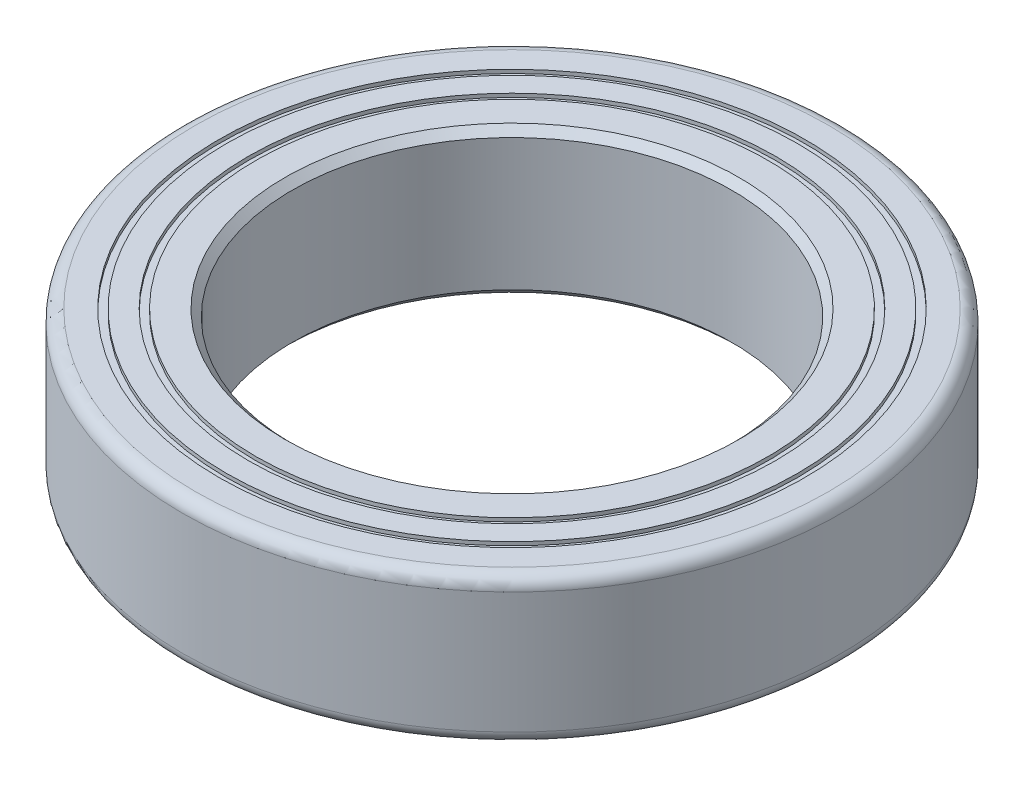
ISO-10303-21;
HEADER;
FILE_DESCRIPTION(('STEP AP214'),'2;1');
FILE_NAME('part.step','',(''),(''),'','','');
FILE_SCHEMA(('AUTOMOTIVE_DESIGN { 1 0 10303 214 1 1 1 1 }'));
ENDSEC;
DATA;
#1=APPLICATION_CONTEXT('core data for automotive mechanical design processes');
#2=APPLICATION_PROTOCOL_DEFINITION('international standard','automotive_design',2000,#1);
#3=PRODUCT_CONTEXT('',#1,'mechanical');
#4=PRODUCT('Part','Part','',(#3));
#5=PRODUCT_RELATED_PRODUCT_CATEGORY('part','',(#4));
#6=PRODUCT_DEFINITION_FORMATION('','',#4);
#7=PRODUCT_DEFINITION_CONTEXT('part definition',#1,'design');
#8=PRODUCT_DEFINITION('design','',#6,#7);
#9=PRODUCT_DEFINITION_SHAPE('','',#8);
#10=(LENGTH_UNIT() NAMED_UNIT(*) SI_UNIT(.MILLI.,.METRE.));
#11=(NAMED_UNIT(*) PLANE_ANGLE_UNIT() SI_UNIT($,.RADIAN.));
#12=(NAMED_UNIT(*) SI_UNIT($,.STERADIAN.) SOLID_ANGLE_UNIT());
#13=UNCERTAINTY_MEASURE_WITH_UNIT(LENGTH_MEASURE(1.E-05),#10,'distance_accuracy_value','');
#14=(GEOMETRIC_REPRESENTATION_CONTEXT(3) GLOBAL_UNCERTAINTY_ASSIGNED_CONTEXT((#13)) GLOBAL_UNIT_ASSIGNED_CONTEXT((#10,
#11,#12)) REPRESENTATION_CONTEXT('',''));
#15=CARTESIAN_POINT('',(0.,0.,0.));
#16=DIRECTION('',(0.,0.,1.));
#17=DIRECTION('',(1.,0.,0.));
#18=AXIS2_PLACEMENT_3D('',#15,#16,#17);
#19=CARTESIAN_POINT('',(9.,0.,0.));
#20=DIRECTION('',(0.,1.,0.));
#21=DIRECTION('',(0.,0.,1.));
#22=AXIS2_PLACEMENT_3D('',#19,#20,#21);
#23=PLANE('',#22);
#24=CARTESIAN_POINT('',(0.,0.,0.));
#25=DIRECTION('',(0.,1.,0.));
#26=DIRECTION('',(0.,0.,1.));
#27=AXIS2_PLACEMENT_3D('',#24,#25,#26);
#28=CIRCLE('',#27,8.656);
#29=CARTESIAN_POINT('',(0.,0.,8.656));
#30=VERTEX_POINT('',#29);
#31=EDGE_CURVE('E69',#30,#30,#28,.F.);
#32=ORIENTED_EDGE('',*,*,#31,.T.);
#33=EDGE_LOOP('',(#32));
#34=FACE_BOUND('',#33,.T.);
#35=CARTESIAN_POINT('',(0.,0.,0.));
#36=DIRECTION('',(0.,1.,0.));
#37=DIRECTION('',(0.,0.,1.));
#38=AXIS2_PLACEMENT_3D('',#35,#36,#37);
#39=CIRCLE('',#38,8.);
#40=CARTESIAN_POINT('',(0.,0.,8.));
#41=VERTEX_POINT('',#40);
#42=EDGE_CURVE('E78',#41,#41,#39,.T.);
#43=ORIENTED_EDGE('',*,*,#42,.T.);
#44=EDGE_LOOP('',(#43));
#45=FACE_BOUND('',#44,.T.);
#46=ADVANCED_FACE('F45',(#34,#45),#23,.F.);
#47=CARTESIAN_POINT('',(0.,2.,0.));
#48=DIRECTION('',(0.,1.,0.));
#49=DIRECTION('',(0.,0.,1.));
#50=AXIS2_PLACEMENT_3D('',#47,#48,#49);
#51=CYLINDRICAL_SURFACE('',#50,8.);
#52=ORIENTED_EDGE('',*,*,#42,.F.);
#53=EDGE_LOOP('',(#52));
#54=FACE_BOUND('',#53,.T.);
#55=CARTESIAN_POINT('',(0.,0.1,0.));
#56=DIRECTION('',(0.,1.,0.));
#57=DIRECTION('',(0.,0.,1.));
#58=AXIS2_PLACEMENT_3D('',#55,#56,#57);
#59=CIRCLE('',#58,8.);
#60=CARTESIAN_POINT('',(0.,0.1,8.));
#61=VERTEX_POINT('',#60);
#62=EDGE_CURVE('E81',#61,#61,#59,.T.);
#63=ORIENTED_EDGE('',*,*,#62,.T.);
#64=EDGE_LOOP('',(#63));
#65=FACE_BOUND('',#64,.T.);
#66=ADVANCED_FACE('F145',(#54,#65),#51,.F.);
#67=CARTESIAN_POINT('',(8.,0.1,0.));
#68=DIRECTION('',(0.,1.,0.));
#69=DIRECTION('',(0.,0.,1.));
#70=AXIS2_PLACEMENT_3D('',#67,#68,#69);
#71=PLANE('',#70);
#72=ORIENTED_EDGE('',*,*,#62,.F.);
#73=EDGE_LOOP('',(#72));
#74=FACE_BOUND('',#73,.T.);
#75=CARTESIAN_POINT('',(0.,0.1,0.));
#76=DIRECTION('',(0.,1.,0.));
#77=DIRECTION('',(0.,0.,1.));
#78=AXIS2_PLACEMENT_3D('',#75,#76,#77);
#79=CIRCLE('',#78,7.8);
#80=CARTESIAN_POINT('',(0.,0.1,7.8));
#81=VERTEX_POINT('',#80);
#82=EDGE_CURVE('E84',#81,#81,#79,.T.);
#83=ORIENTED_EDGE('',*,*,#82,.T.);
#84=EDGE_LOOP('',(#83));
#85=FACE_BOUND('',#84,.T.);
#86=ADVANCED_FACE('F151',(#74,#85),#71,.F.);
#87=CARTESIAN_POINT('',(0.,2.,0.));
#88=DIRECTION('',(0.,1.,0.));
#89=DIRECTION('',(0.,0.,1.));
#90=AXIS2_PLACEMENT_3D('',#87,#88,#89);
#91=CYLINDRICAL_SURFACE('',#90,7.8);
#92=ORIENTED_EDGE('',*,*,#82,.F.);
#93=EDGE_LOOP('',(#92));
#94=FACE_BOUND('',#93,.T.);
#95=CARTESIAN_POINT('',(0.,0.,0.));
#96=DIRECTION('',(0.,1.,0.));
#97=DIRECTION('',(0.,0.,1.));
#98=AXIS2_PLACEMENT_3D('',#95,#96,#97);
#99=CIRCLE('',#98,7.8);
#100=CARTESIAN_POINT('',(0.,0.,7.8));
#101=VERTEX_POINT('',#100);
#102=EDGE_CURVE('E87',#101,#101,#99,.T.);
#103=ORIENTED_EDGE('',*,*,#102,.T.);
#104=EDGE_LOOP('',(#103));
#105=FACE_BOUND('',#104,.T.);
#106=ADVANCED_FACE('F205',(#94,#105),#91,.T.);
#107=CARTESIAN_POINT('',(7.2,0.,0.));
#108=DIRECTION('',(0.,1.,0.));
#109=DIRECTION('',(0.,0.,1.));
#110=AXIS2_PLACEMENT_3D('',#107,#108,#109);
#111=PLANE('',#110);
#112=ORIENTED_EDGE('',*,*,#102,.F.);
#113=EDGE_LOOP('',(#112));
#114=FACE_BOUND('',#113,.T.);
#115=CARTESIAN_POINT('',(0.,0.,0.));
#116=DIRECTION('',(0.,1.,0.));
#117=DIRECTION('',(0.,0.,1.));
#118=AXIS2_PLACEMENT_3D('',#115,#116,#117);
#119=CIRCLE('',#118,7.2);
#120=CARTESIAN_POINT('',(0.,0.,7.2));
#121=VERTEX_POINT('',#120);
#122=EDGE_CURVE('E90',#121,#121,#119,.T.);
#123=ORIENTED_EDGE('',*,*,#122,.T.);
#124=EDGE_LOOP('',(#123));
#125=FACE_BOUND('',#124,.T.);
#126=ADVANCED_FACE('F201',(#114,#125),#111,.F.);
#127=CARTESIAN_POINT('',(0.,2.,0.));
#128=DIRECTION('',(0.,1.,0.));
#129=DIRECTION('',(0.,0.,1.));
#130=AXIS2_PLACEMENT_3D('',#127,#128,#129);
#131=CYLINDRICAL_SURFACE('',#130,7.2);
#132=ORIENTED_EDGE('',*,*,#122,.F.);
#133=EDGE_LOOP('',(#132));
#134=FACE_BOUND('',#133,.T.);
#135=CARTESIAN_POINT('',(0.,0.1,0.));
#136=DIRECTION('',(0.,1.,0.));
#137=DIRECTION('',(0.,0.,1.));
#138=AXIS2_PLACEMENT_3D('',#135,#136,#137);
#139=CIRCLE('',#138,7.2);
#140=CARTESIAN_POINT('',(0.,0.1,7.2));
#141=VERTEX_POINT('',#140);
#142=EDGE_CURVE('E93',#141,#141,#139,.T.);
#143=ORIENTED_EDGE('',*,*,#142,.T.);
#144=EDGE_LOOP('',(#143));
#145=FACE_BOUND('',#144,.T.);
#146=ADVANCED_FACE('F193',(#134,#145),#131,.F.);
#147=CARTESIAN_POINT('',(7.,0.1,0.));
#148=DIRECTION('',(0.,1.,0.));
#149=DIRECTION('',(0.,0.,1.));
#150=AXIS2_PLACEMENT_3D('',#147,#148,#149);
#151=PLANE('',#150);
#152=ORIENTED_EDGE('',*,*,#142,.F.);
#153=EDGE_LOOP('',(#152));
#154=FACE_BOUND('',#153,.T.);
#155=CARTESIAN_POINT('',(0.,0.1,0.));
#156=DIRECTION('',(0.,1.,0.));
#157=DIRECTION('',(0.,0.,1.));
#158=AXIS2_PLACEMENT_3D('',#155,#156,#157);
#159=CIRCLE('',#158,7.);
#160=CARTESIAN_POINT('',(0.,0.1,7.));
#161=VERTEX_POINT('',#160);
#162=EDGE_CURVE('E96',#161,#161,#159,.T.);
#163=ORIENTED_EDGE('',*,*,#162,.T.);
#164=EDGE_LOOP('',(#163));
#165=FACE_BOUND('',#164,.T.);
#166=ADVANCED_FACE('F186',(#154,#165),#151,.F.);
#167=CARTESIAN_POINT('',(0.,2.,0.));
#168=DIRECTION('',(0.,1.,0.));
#169=DIRECTION('',(0.,0.,1.));
#170=AXIS2_PLACEMENT_3D('',#167,#168,#169);
#171=CYLINDRICAL_SURFACE('',#170,7.);
#172=ORIENTED_EDGE('',*,*,#162,.F.);
#173=EDGE_LOOP('',(#172));
#174=FACE_BOUND('',#173,.T.);
#175=CARTESIAN_POINT('',(0.,0.,0.));
#176=DIRECTION('',(0.,1.,0.));
#177=DIRECTION('',(0.,0.,1.));
#178=AXIS2_PLACEMENT_3D('',#175,#176,#177);
#179=CIRCLE('',#178,7.);
#180=CARTESIAN_POINT('',(0.,0.,7.));
#181=VERTEX_POINT('',#180);
#182=EDGE_CURVE('E99',#181,#181,#179,.T.);
#183=ORIENTED_EDGE('',*,*,#182,.T.);
#184=EDGE_LOOP('',(#183));
#185=FACE_BOUND('',#184,.T.);
#186=ADVANCED_FACE('F181',(#174,#185),#171,.T.);
#187=CARTESIAN_POINT('',(6.,0.,0.));
#188=DIRECTION('',(0.,1.,0.));
#189=DIRECTION('',(0.,0.,1.));
#190=AXIS2_PLACEMENT_3D('',#187,#188,#189);
#191=PLANE('',#190);
#192=CARTESIAN_POINT('',(0.,0.,0.));
#193=DIRECTION('',(0.,1.,0.));
#194=DIRECTION('',(0.,0.,1.));
#195=AXIS2_PLACEMENT_3D('',#192,#193,#194);
#196=CIRCLE('',#195,6.2);
#197=CARTESIAN_POINT('',(0.,0.,6.2));
#198=VERTEX_POINT('',#197);
#199=EDGE_CURVE('E61',#198,#198,#196,.T.);
#200=ORIENTED_EDGE('',*,*,#199,.T.);
#201=EDGE_LOOP('',(#200));
#202=FACE_BOUND('',#201,.T.);
#203=ORIENTED_EDGE('',*,*,#182,.F.);
#204=EDGE_LOOP('',(#203));
#205=FACE_BOUND('',#204,.T.);
#206=ADVANCED_FACE('F177',(#202,#205),#191,.F.);
#207=CARTESIAN_POINT('',(0.,2.,0.));
#208=DIRECTION('',(0.,1.,0.));
#209=DIRECTION('',(0.,0.,1.));
#210=AXIS2_PLACEMENT_3D('',#207,#208,#209);
#211=CYLINDRICAL_SURFACE('',#210,6.);
#212=CARTESIAN_POINT('',(0.,0.200000000000003,0.));
#213=DIRECTION('',(0.,1.,0.));
#214=DIRECTION('',(0.,0.,1.));
#215=AXIS2_PLACEMENT_3D('',#212,#213,#214);
#216=CIRCLE('',#215,6.);
#217=CARTESIAN_POINT('',(0.,0.200000000000003,6.));
#218=VERTEX_POINT('',#217);
#219=EDGE_CURVE('E53',#218,#218,#216,.F.);
#220=ORIENTED_EDGE('',*,*,#219,.T.);
#221=EDGE_LOOP('',(#220));
#222=FACE_BOUND('',#221,.T.);
#223=CARTESIAN_POINT('',(0.,3.80000000000001,0.));
#224=DIRECTION('',(0.,-1.,0.));
#225=DIRECTION('',(0.,0.,-1.));
#226=AXIS2_PLACEMENT_3D('',#223,#224,#225);
#227=CIRCLE('',#226,6.);
#228=CARTESIAN_POINT('',(0.,3.80000000000001,6.));
#229=VERTEX_POINT('',#228);
#230=EDGE_CURVE('E57',#229,#229,#227,.F.);
#231=ORIENTED_EDGE('',*,*,#230,.T.);
#232=EDGE_LOOP('',(#231));
#233=FACE_BOUND('',#232,.T.);
#234=ADVANCED_FACE('F180',(#222,#233),#211,.F.);
#235=CARTESIAN_POINT('',(6.,4.,0.));
#236=DIRECTION('',(0.,-1.,0.));
#237=DIRECTION('',(0.,0.,-1.));
#238=AXIS2_PLACEMENT_3D('',#235,#236,#237);
#239=PLANE('',#238);
#240=CARTESIAN_POINT('',(0.,4.,0.));
#241=DIRECTION('',(0.,-1.,0.));
#242=DIRECTION('',(0.,0.,-1.));
#243=AXIS2_PLACEMENT_3D('',#240,#241,#242);
#244=CIRCLE('',#243,6.19999999999999);
#245=CARTESIAN_POINT('',(0.,4.,6.19999999999999));
#246=VERTEX_POINT('',#245);
#247=EDGE_CURVE('E10',#246,#246,#244,.T.);
#248=ORIENTED_EDGE('',*,*,#247,.T.);
#249=EDGE_LOOP('',(#248));
#250=FACE_BOUND('',#249,.T.);
#251=CARTESIAN_POINT('',(0.,4.,0.));
#252=DIRECTION('',(0.,1.,0.));
#253=DIRECTION('',(0.,0.,1.));
#254=AXIS2_PLACEMENT_3D('',#251,#252,#253);
#255=CIRCLE('',#254,7.);
#256=CARTESIAN_POINT('',(0.,4.,7.));
#257=VERTEX_POINT('',#256);
#258=EDGE_CURVE('E102',#257,#257,#255,.T.);
#259=ORIENTED_EDGE('',*,*,#258,.T.);
#260=EDGE_LOOP('',(#259));
#261=FACE_BOUND('',#260,.T.);
#262=ADVANCED_FACE('F272',(#250,#261),#239,.F.);
#263=CARTESIAN_POINT('',(0.,2.,0.));
#264=DIRECTION('',(0.,1.,0.));
#265=DIRECTION('',(0.,0.,1.));
#266=AXIS2_PLACEMENT_3D('',#263,#264,#265);
#267=CYLINDRICAL_SURFACE('',#266,7.);
#268=ORIENTED_EDGE('',*,*,#258,.F.);
#269=EDGE_LOOP('',(#268));
#270=FACE_BOUND('',#269,.T.);
#271=CARTESIAN_POINT('',(0.,3.9,0.));
#272=DIRECTION('',(0.,1.,0.));
#273=DIRECTION('',(0.,0.,1.));
#274=AXIS2_PLACEMENT_3D('',#271,#272,#273);
#275=CIRCLE('',#274,7.);
#276=CARTESIAN_POINT('',(0.,3.9,7.));
#277=VERTEX_POINT('',#276);
#278=EDGE_CURVE('E105',#277,#277,#275,.T.);
#279=ORIENTED_EDGE('',*,*,#278,.T.);
#280=EDGE_LOOP('',(#279));
#281=FACE_BOUND('',#280,.T.);
#282=ADVANCED_FACE('F279',(#270,#281),#267,.T.);
#283=CARTESIAN_POINT('',(7.,3.9,0.));
#284=DIRECTION('',(0.,-1.,0.));
#285=DIRECTION('',(0.,0.,-1.));
#286=AXIS2_PLACEMENT_3D('',#283,#284,#285);
#287=PLANE('',#286);
#288=ORIENTED_EDGE('',*,*,#278,.F.);
#289=EDGE_LOOP('',(#288));
#290=FACE_BOUND('',#289,.T.);
#291=CARTESIAN_POINT('',(0.,3.9,0.));
#292=DIRECTION('',(0.,1.,0.));
#293=DIRECTION('',(0.,0.,1.));
#294=AXIS2_PLACEMENT_3D('',#291,#292,#293);
#295=CIRCLE('',#294,7.2);
#296=CARTESIAN_POINT('',(0.,3.9,7.2));
#297=VERTEX_POINT('',#296);
#298=EDGE_CURVE('E108',#297,#297,#295,.T.);
#299=ORIENTED_EDGE('',*,*,#298,.T.);
#300=EDGE_LOOP('',(#299));
#301=FACE_BOUND('',#300,.T.);
#302=ADVANCED_FACE('F287',(#290,#301),#287,.F.);
#303=CARTESIAN_POINT('',(0.,2.,0.));
#304=DIRECTION('',(0.,1.,0.));
#305=DIRECTION('',(0.,0.,1.));
#306=AXIS2_PLACEMENT_3D('',#303,#304,#305);
#307=CYLINDRICAL_SURFACE('',#306,7.2);
#308=ORIENTED_EDGE('',*,*,#298,.F.);
#309=EDGE_LOOP('',(#308));
#310=FACE_BOUND('',#309,.T.);
#311=CARTESIAN_POINT('',(0.,4.,0.));
#312=DIRECTION('',(0.,1.,0.));
#313=DIRECTION('',(0.,0.,1.));
#314=AXIS2_PLACEMENT_3D('',#311,#312,#313);
#315=CIRCLE('',#314,7.2);
#316=CARTESIAN_POINT('',(0.,4.,7.2));
#317=VERTEX_POINT('',#316);
#318=EDGE_CURVE('E111',#317,#317,#315,.T.);
#319=ORIENTED_EDGE('',*,*,#318,.T.);
#320=EDGE_LOOP('',(#319));
#321=FACE_BOUND('',#320,.T.);
#322=ADVANCED_FACE('F297',(#310,#321),#307,.F.);
#323=CARTESIAN_POINT('',(7.2,4.,0.));
#324=DIRECTION('',(0.,-1.,0.));
#325=DIRECTION('',(0.,0.,-1.));
#326=AXIS2_PLACEMENT_3D('',#323,#324,#325);
#327=PLANE('',#326);
#328=ORIENTED_EDGE('',*,*,#318,.F.);
#329=EDGE_LOOP('',(#328));
#330=FACE_BOUND('',#329,.T.);
#331=CARTESIAN_POINT('',(0.,4.,0.));
#332=DIRECTION('',(0.,1.,0.));
#333=DIRECTION('',(0.,0.,1.));
#334=AXIS2_PLACEMENT_3D('',#331,#332,#333);
#335=CIRCLE('',#334,7.8);
#336=CARTESIAN_POINT('',(0.,4.,7.8));
#337=VERTEX_POINT('',#336);
#338=EDGE_CURVE('E114',#337,#337,#335,.T.);
#339=ORIENTED_EDGE('',*,*,#338,.T.);
#340=EDGE_LOOP('',(#339));
#341=FACE_BOUND('',#340,.T.);
#342=ADVANCED_FACE('F307',(#330,#341),#327,.F.);
#343=CARTESIAN_POINT('',(0.,2.,0.));
#344=DIRECTION('',(0.,1.,0.));
#345=DIRECTION('',(0.,0.,1.));
#346=AXIS2_PLACEMENT_3D('',#343,#344,#345);
#347=CYLINDRICAL_SURFACE('',#346,7.8);
#348=ORIENTED_EDGE('',*,*,#338,.F.);
#349=EDGE_LOOP('',(#348));
#350=FACE_BOUND('',#349,.T.);
#351=CARTESIAN_POINT('',(0.,3.9,0.));
#352=DIRECTION('',(0.,1.,0.));
#353=DIRECTION('',(0.,0.,1.));
#354=AXIS2_PLACEMENT_3D('',#351,#352,#353);
#355=CIRCLE('',#354,7.8);
#356=CARTESIAN_POINT('',(0.,3.9,7.8));
#357=VERTEX_POINT('',#356);
#358=EDGE_CURVE('E117',#357,#357,#355,.T.);
#359=ORIENTED_EDGE('',*,*,#358,.T.);
#360=EDGE_LOOP('',(#359));
#361=FACE_BOUND('',#360,.T.);
#362=ADVANCED_FACE('F318',(#350,#361),#347,.T.);
#363=CARTESIAN_POINT('',(8.,3.9,0.));
#364=DIRECTION('',(0.,-1.,0.));
#365=DIRECTION('',(0.,0.,-1.));
#366=AXIS2_PLACEMENT_3D('',#363,#364,#365);
#367=PLANE('',#366);
#368=ORIENTED_EDGE('',*,*,#358,.F.);
#369=EDGE_LOOP('',(#368));
#370=FACE_BOUND('',#369,.T.);
#371=CARTESIAN_POINT('',(0.,3.9,0.));
#372=DIRECTION('',(0.,1.,0.));
#373=DIRECTION('',(0.,0.,1.));
#374=AXIS2_PLACEMENT_3D('',#371,#372,#373);
#375=CIRCLE('',#374,8.);
#376=CARTESIAN_POINT('',(0.,3.9,8.));
#377=VERTEX_POINT('',#376);
#378=EDGE_CURVE('E120',#377,#377,#375,.T.);
#379=ORIENTED_EDGE('',*,*,#378,.T.);
#380=EDGE_LOOP('',(#379));
#381=FACE_BOUND('',#380,.T.);
#382=ADVANCED_FACE('F142',(#370,#381),#367,.F.);
#383=CARTESIAN_POINT('',(0.,2.,0.));
#384=DIRECTION('',(0.,1.,0.));
#385=DIRECTION('',(0.,0.,1.));
#386=AXIS2_PLACEMENT_3D('',#383,#384,#385);
#387=CYLINDRICAL_SURFACE('',#386,8.);
#388=ORIENTED_EDGE('',*,*,#378,.F.);
#389=EDGE_LOOP('',(#388));
#390=FACE_BOUND('',#389,.T.);
#391=CARTESIAN_POINT('',(0.,4.,0.));
#392=DIRECTION('',(0.,1.,0.));
#393=DIRECTION('',(0.,0.,1.));
#394=AXIS2_PLACEMENT_3D('',#391,#392,#393);
#395=CIRCLE('',#394,8.);
#396=CARTESIAN_POINT('',(0.,4.,8.));
#397=VERTEX_POINT('',#396);
#398=EDGE_CURVE('E123',#397,#397,#395,.T.);
#399=ORIENTED_EDGE('',*,*,#398,.T.);
#400=EDGE_LOOP('',(#399));
#401=FACE_BOUND('',#400,.T.);
#402=ADVANCED_FACE('F127',(#390,#401),#387,.F.);
#403=CARTESIAN_POINT('',(9.,4.,0.));
#404=DIRECTION('',(0.,-1.,0.));
#405=DIRECTION('',(0.,0.,-1.));
#406=AXIS2_PLACEMENT_3D('',#403,#404,#405);
#407=PLANE('',#406);
#408=CARTESIAN_POINT('',(0.,4.,0.));
#409=DIRECTION('',(0.,-1.,0.));
#410=DIRECTION('',(0.,0.,-1.));
#411=AXIS2_PLACEMENT_3D('',#408,#409,#410);
#412=CIRCLE('',#411,8.656);
#413=CARTESIAN_POINT('',(0.,4.,-8.656));
#414=VERTEX_POINT('',#413);
#415=EDGE_CURVE('E66',#414,#414,#412,.F.);
#416=ORIENTED_EDGE('',*,*,#415,.T.);
#417=EDGE_LOOP('',(#416));
#418=FACE_BOUND('',#417,.T.);
#419=ORIENTED_EDGE('',*,*,#398,.F.);
#420=EDGE_LOOP('',(#419));
#421=FACE_BOUND('',#420,.T.);
#422=ADVANCED_FACE('F129',(#418,#421),#407,.F.);
#423=CARTESIAN_POINT('',(0.,2.,0.));
#424=DIRECTION('',(0.,1.,0.));
#425=DIRECTION('',(0.,0.,1.));
#426=AXIS2_PLACEMENT_3D('',#423,#424,#425);
#427=CYLINDRICAL_SURFACE('',#426,9.);
#428=CARTESIAN_POINT('',(0.,0.344,0.));
#429=DIRECTION('',(0.,1.,0.));
#430=DIRECTION('',(0.,0.,1.));
#431=AXIS2_PLACEMENT_3D('',#428,#429,#430);
#432=CIRCLE('',#431,9.);
#433=CARTESIAN_POINT('',(0.,0.344,9.));
#434=VERTEX_POINT('',#433);
#435=EDGE_CURVE('E72',#434,#434,#432,.T.);
#436=ORIENTED_EDGE('',*,*,#435,.T.);
#437=EDGE_LOOP('',(#436));
#438=FACE_BOUND('',#437,.T.);
#439=CARTESIAN_POINT('',(0.,3.656,0.));
#440=DIRECTION('',(0.,-1.,0.));
#441=DIRECTION('',(0.,0.,-1.));
#442=AXIS2_PLACEMENT_3D('',#439,#440,#441);
#443=CIRCLE('',#442,9.);
#444=CARTESIAN_POINT('',(0.,3.656,-9.));
#445=VERTEX_POINT('',#444);
#446=EDGE_CURVE('E75',#445,#445,#443,.T.);
#447=ORIENTED_EDGE('',*,*,#446,.T.);
#448=EDGE_LOOP('',(#447));
#449=FACE_BOUND('',#448,.T.);
#450=ADVANCED_FACE('F131',(#438,#449),#427,.T.);
#451=CARTESIAN_POINT('',(0.,0.344,0.));
#452=DIRECTION('',(0.,1.,0.));
#453=DIRECTION('',(0.,0.,1.));
#454=AXIS2_PLACEMENT_3D('',#451,#452,#453);
#455=TOROIDAL_SURFACE('',#454,8.656,0.344);
#456=ORIENTED_EDGE('',*,*,#31,.F.);
#457=EDGE_LOOP('',(#456));
#458=FACE_BOUND('',#457,.T.);
#459=ORIENTED_EDGE('',*,*,#435,.F.);
#460=EDGE_LOOP('',(#459));
#461=FACE_BOUND('',#460,.T.);
#462=ADVANCED_FACE('F138',(#458,#461),#455,.T.);
#463=CARTESIAN_POINT('',(0.,3.656,0.));
#464=DIRECTION('',(0.,-1.,0.));
#465=DIRECTION('',(0.,0.,-1.));
#466=AXIS2_PLACEMENT_3D('',#463,#464,#465);
#467=TOROIDAL_SURFACE('',#466,8.656,0.344);
#468=ORIENTED_EDGE('',*,*,#446,.F.);
#469=EDGE_LOOP('',(#468));
#470=FACE_BOUND('',#469,.T.);
#471=ORIENTED_EDGE('',*,*,#415,.F.);
#472=EDGE_LOOP('',(#471));
#473=FACE_BOUND('',#472,.T.);
#474=ADVANCED_FACE('F159',(#470,#473),#467,.T.);
#475=CARTESIAN_POINT('',(0.,0.,0.));
#476=DIRECTION('',(0.,-1.,0.));
#477=DIRECTION('',(0.,0.,-1.));
#478=AXIS2_PLACEMENT_3D('',#475,#476,#477);
#479=CONICAL_SURFACE('',#478,6.2,0.785398163397446);
#480=ORIENTED_EDGE('',*,*,#219,.F.);
#481=EDGE_LOOP('',(#480));
#482=FACE_BOUND('',#481,.T.);
#483=ORIENTED_EDGE('',*,*,#199,.F.);
#484=EDGE_LOOP('',(#483));
#485=FACE_BOUND('',#484,.T.);
#486=ADVANCED_FACE('F162',(#482,#485),#479,.F.);
#487=CARTESIAN_POINT('',(0.,3.80000000000001,0.));
#488=DIRECTION('',(0.,1.,0.));
#489=DIRECTION('',(0.,0.,1.));
#490=AXIS2_PLACEMENT_3D('',#487,#488,#489);
#491=CONICAL_SURFACE('',#490,6.,0.785398163397446);
#492=CARTESIAN_POINT('',(0.,4.,6.19999999999999));
#493=CARTESIAN_POINT('',(0.,3.99791666666667,6.19791666666666));
#494=CARTESIAN_POINT('',(0.,3.99583333333333,6.19583333333333));
#495=CARTESIAN_POINT('',(0.,3.99166666666667,6.19166666666666));
#496=CARTESIAN_POINT('',(0.,3.98958333333333,6.18958333333333));
#497=CARTESIAN_POINT('',(0.,3.98541666666667,6.18541666666666));
#498=CARTESIAN_POINT('',(0.,3.98333333333333,6.18333333333333));
#499=CARTESIAN_POINT('',(0.,3.97916666666667,6.17916666666666));
#500=CARTESIAN_POINT('',(0.,3.97708333333333,6.17708333333333));
#501=CARTESIAN_POINT('',(0.,3.97291666666667,6.17291666666666));
#502=CARTESIAN_POINT('',(0.,3.97083333333333,6.17083333333333));
#503=CARTESIAN_POINT('',(0.,3.96666666666667,6.16666666666666));
#504=CARTESIAN_POINT('',(0.,3.96458333333333,6.16458333333333));
#505=CARTESIAN_POINT('',(0.,3.96041666666667,6.16041666666666));
#506=CARTESIAN_POINT('',(0.,3.95833333333333,6.15833333333333));
#507=CARTESIAN_POINT('',(0.,3.95416666666667,6.15416666666666));
#508=CARTESIAN_POINT('',(0.,3.95208333333334,6.15208333333333));
#509=CARTESIAN_POINT('',(0.,3.94791666666667,6.14791666666666));
#510=CARTESIAN_POINT('',(0.,3.94583333333334,6.14583333333333));
#511=CARTESIAN_POINT('',(0.,3.94166666666667,6.14166666666666));
#512=CARTESIAN_POINT('',(0.,3.93958333333333,6.13958333333333));
#513=CARTESIAN_POINT('',(0.,3.93541666666667,6.13541666666666));
#514=CARTESIAN_POINT('',(0.,3.93333333333334,6.13333333333333));
#515=CARTESIAN_POINT('',(0.,3.92916666666667,6.12916666666666));
#516=CARTESIAN_POINT('',(0.,3.92708333333334,6.12708333333333));
#517=CARTESIAN_POINT('',(0.,3.92291666666667,6.12291666666666));
#518=CARTESIAN_POINT('',(0.,3.92083333333334,6.12083333333333));
#519=CARTESIAN_POINT('',(0.,3.91666666666667,6.11666666666666));
#520=CARTESIAN_POINT('',(0.,3.91458333333334,6.11458333333333));
#521=CARTESIAN_POINT('',(0.,3.91041666666667,6.11041666666666));
#522=CARTESIAN_POINT('',(0.,3.90833333333334,6.10833333333333));
#523=CARTESIAN_POINT('',(0.,3.90416666666667,6.10416666666666));
#524=CARTESIAN_POINT('',(0.,3.90208333333334,6.10208333333333));
#525=CARTESIAN_POINT('',(0.,3.89791666666667,6.09791666666666));
#526=CARTESIAN_POINT('',(0.,3.89583333333334,6.09583333333333));
#527=CARTESIAN_POINT('',(0.,3.89166666666667,6.09166666666666));
#528=CARTESIAN_POINT('',(0.,3.88958333333334,6.08958333333333));
#529=CARTESIAN_POINT('',(0.,3.88541666666667,6.08541666666666));
#530=CARTESIAN_POINT('',(0.,3.88333333333334,6.08333333333333));
#531=CARTESIAN_POINT('',(0.,3.87916666666667,6.07916666666666));
#532=CARTESIAN_POINT('',(0.,3.87708333333334,6.07708333333333));
#533=CARTESIAN_POINT('',(0.,3.87291666666667,6.07291666666667));
#534=CARTESIAN_POINT('',(0.,3.87083333333334,6.07083333333333));
#535=CARTESIAN_POINT('',(0.,3.86666666666667,6.06666666666667));
#536=CARTESIAN_POINT('',(0.,3.86458333333334,6.06458333333333));
#537=CARTESIAN_POINT('',(0.,3.86041666666667,6.06041666666667));
#538=CARTESIAN_POINT('',(0.,3.85833333333334,6.05833333333333));
#539=CARTESIAN_POINT('',(0.,3.85416666666667,6.05416666666667));
#540=CARTESIAN_POINT('',(0.,3.85208333333334,6.05208333333333));
#541=CARTESIAN_POINT('',(0.,3.84791666666667,6.04791666666667));
#542=CARTESIAN_POINT('',(0.,3.84583333333334,6.04583333333333));
#543=CARTESIAN_POINT('',(0.,3.84166666666667,6.04166666666667));
#544=CARTESIAN_POINT('',(0.,3.83958333333334,6.03958333333333));
#545=CARTESIAN_POINT('',(0.,3.83541666666667,6.03541666666667));
#546=CARTESIAN_POINT('',(0.,3.83333333333334,6.03333333333333));
#547=CARTESIAN_POINT('',(0.,3.82916666666667,6.02916666666667));
#548=CARTESIAN_POINT('',(0.,3.82708333333334,6.02708333333333));
#549=CARTESIAN_POINT('',(0.,3.82291666666667,6.02291666666667));
#550=CARTESIAN_POINT('',(0.,3.82083333333334,6.02083333333333));
#551=CARTESIAN_POINT('',(0.,3.81666666666667,6.01666666666667));
#552=CARTESIAN_POINT('',(0.,3.81458333333334,6.01458333333333));
#553=CARTESIAN_POINT('',(0.,3.81041666666667,6.01041666666667));
#554=CARTESIAN_POINT('',(0.,3.80833333333334,6.00833333333333));
#555=CARTESIAN_POINT('',(0.,3.80416666666667,6.00416666666667));
#556=CARTESIAN_POINT('',(0.,3.80208333333334,6.00208333333333));
#557=CARTESIAN_POINT('',(0.,3.80000000000001,6.));
#558=B_SPLINE_CURVE_WITH_KNOTS('',3,(#492,#493,#494,#495,#496,#497,#498,#499,#500,#501,#502,
#503,#504,#505,#506,#507,#508,#509,#510,#511,#512,#513,#514,#515,#516,#517,#518,#519,#520,#521,
#522,#523,#524,#525,#526,#527,#528,#529,#530,#531,#532,#533,#534,#535,#536,#537,#538,#539,#540,
#541,#542,#543,#544,#545,#546,#547,#548,#549,#550,#551,#552,#553,#554,#555,#556,#557),
.UNSPECIFIED.,.F.,.F.,(4,2,2,2,2,2,2,2,2,2,2,2,2,2,2,2,2,2,2,2,2,2,2,2,2,2,2,2,2,2,2,2,4),(0.,
0.0088388347648321,0.0176776695296642,0.0265165042944951,0.0353553390593272,0.044194173824158,
0.0530330085889901,0.0618718433538216,0.0707106781186531,0.0795495128834852,0.0883883476483167,
0.0972271824131481,0.10606601717798,0.114904851942811,0.123743686707643,0.132582521472474,
0.141421356237306,0.150260191002137,0.159099025766969,0.167937860531801,0.176776695296632,
0.185615530061464,0.194454364826295,0.203293199591127,0.212132034355959,0.22097086912079,
0.229809703885622,0.238648538650453,0.247487373415285,0.256326208180117,0.265165042944949,
0.27400387770978,0.282842712474612),.UNSPECIFIED.);
#559=EDGE_CURVE('BSEAM48',#246,#229,#558,.T.);
#560=ORIENTED_EDGE('',*,*,#247,.F.);
#561=ORIENTED_EDGE('',*,*,#230,.F.);
#562=ORIENTED_EDGE('',*,*,#559,.T.);
#563=ORIENTED_EDGE('',*,*,#559,.F.);
#564=EDGE_LOOP('',(#560,#562,#561,#563));
#565=FACE_BOUND('',#564,.T.);
#566=ADVANCED_FACE('F48',(#565),#491,.F.);
#567=CLOSED_SHELL('',(#46,#66,#86,#106,#126,#146,#166,#186,#206,#234,#262,#282,#302,#322,#342,
#362,#382,#402,#422,#450,#462,#474,#486,#566));
#568=MANIFOLD_SOLID_BREP('B2',#567);
#569=ADVANCED_BREP_SHAPE_REPRESENTATION('',(#18,#568),#14);
#570=SHAPE_DEFINITION_REPRESENTATION(#9,#569);
ENDSEC;
END-ISO-10303-21;
